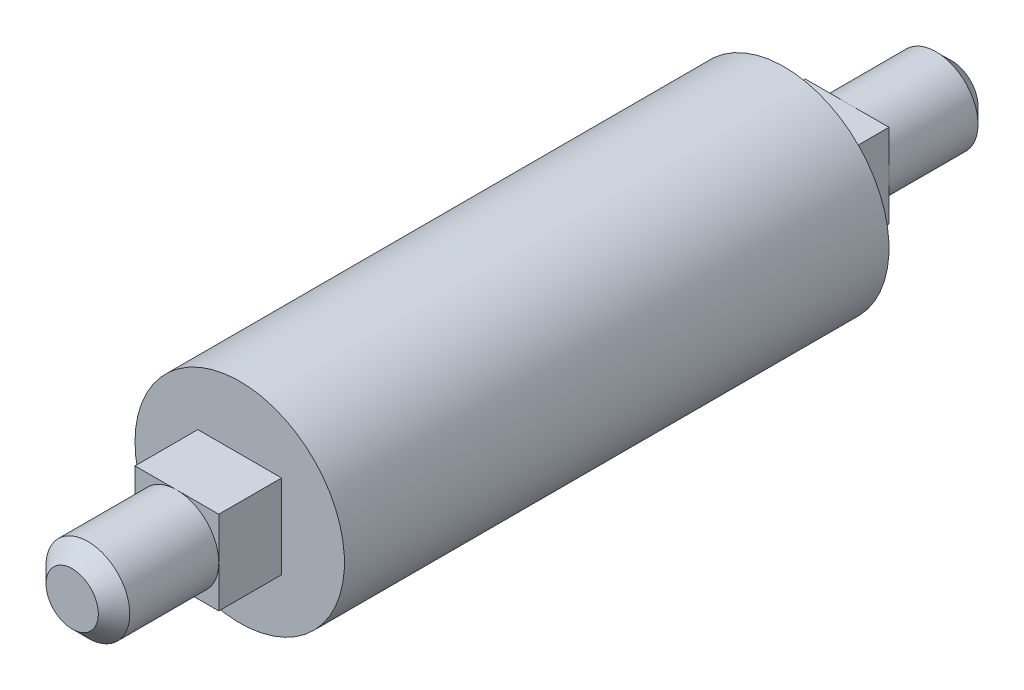
ISO-10303-21;
HEADER;
FILE_DESCRIPTION(('STEP AP214'),'2;1');
FILE_NAME('part.step','',(''),(''),'','','');
FILE_SCHEMA(('AUTOMOTIVE_DESIGN { 1 0 10303 214 1 1 1 1 }'));
ENDSEC;
DATA;
#1=APPLICATION_CONTEXT('core data for automotive mechanical design processes');
#2=APPLICATION_PROTOCOL_DEFINITION('international standard','automotive_design',2000,#1);
#3=PRODUCT_CONTEXT('',#1,'mechanical');
#4=PRODUCT('Part','Part','',(#3));
#5=PRODUCT_RELATED_PRODUCT_CATEGORY('part','',(#4));
#6=PRODUCT_DEFINITION_FORMATION('','',#4);
#7=PRODUCT_DEFINITION_CONTEXT('part definition',#1,'design');
#8=PRODUCT_DEFINITION('design','',#6,#7);
#9=PRODUCT_DEFINITION_SHAPE('','',#8);
#10=(LENGTH_UNIT() NAMED_UNIT(*) SI_UNIT(.MILLI.,.METRE.));
#11=(NAMED_UNIT(*) PLANE_ANGLE_UNIT() SI_UNIT($,.RADIAN.));
#12=(NAMED_UNIT(*) SI_UNIT($,.STERADIAN.) SOLID_ANGLE_UNIT());
#13=UNCERTAINTY_MEASURE_WITH_UNIT(LENGTH_MEASURE(1.E-05),#10,'distance_accuracy_value','');
#14=(GEOMETRIC_REPRESENTATION_CONTEXT(3) GLOBAL_UNCERTAINTY_ASSIGNED_CONTEXT((#13)) GLOBAL_UNIT_ASSIGNED_CONTEXT((#10,
#11,#12)) REPRESENTATION_CONTEXT('',''));
#15=CARTESIAN_POINT('',(0.,0.,0.));
#16=DIRECTION('',(0.,0.,1.));
#17=DIRECTION('',(1.,0.,0.));
#18=AXIS2_PLACEMENT_3D('',#15,#16,#17);
#19=CARTESIAN_POINT('',(0.,0.,32.));
#20=DIRECTION('',(0.,0.,1.));
#21=DIRECTION('',(1.,0.,0.));
#22=AXIS2_PLACEMENT_3D('',#19,#20,#21);
#23=PLANE('',#22);
#24=CARTESIAN_POINT('',(0.,0.,32.));
#25=DIRECTION('',(0.,0.,1.));
#26=DIRECTION('',(1.,0.,0.));
#27=AXIS2_PLACEMENT_3D('',#24,#25,#26);
#28=CIRCLE('',#27,4.);
#29=CARTESIAN_POINT('',(4.,0.,32.));
#30=VERTEX_POINT('',#29);
#31=CARTESIAN_POINT('',(0.,4.,32.));
#32=VERTEX_POINT('',#31);
#33=EDGE_CURVE('E206',#30,#32,#28,.T.);
#34=ORIENTED_EDGE('',*,*,#33,.F.);
#35=DIRECTION('',(0.,1.,0.));
#36=VECTOR('',#35,1.);
#37=CARTESIAN_POINT('',(4.,-4.,32.));
#38=LINE('',#37,#36);
#39=CARTESIAN_POINT('',(4.,4.,32.));
#40=VERTEX_POINT('',#39);
#41=EDGE_CURVE('E217',#30,#40,#38,.T.);
#42=ORIENTED_EDGE('',*,*,#41,.T.);
#43=DIRECTION('',(-1.,0.,0.));
#44=VECTOR('',#43,1.);
#45=CARTESIAN_POINT('',(4.,4.,32.));
#46=LINE('',#45,#44);
#47=EDGE_CURVE('E221',#40,#32,#46,.T.);
#48=ORIENTED_EDGE('',*,*,#47,.T.);
#49=EDGE_LOOP('',(#34,#42,#48));
#50=FACE_BOUND('',#49,.T.);
#51=ADVANCED_FACE('F37',(#50),#23,.T.);
#52=CARTESIAN_POINT('',(-4.,0.,32.));
#53=VERTEX_POINT('',#52);
#54=EDGE_CURVE('E52',#32,#53,#28,.T.);
#55=ORIENTED_EDGE('',*,*,#54,.F.);
#56=CARTESIAN_POINT('',(-4.,4.,32.));
#57=VERTEX_POINT('',#56);
#58=EDGE_CURVE('E220',#32,#57,#46,.T.);
#59=ORIENTED_EDGE('',*,*,#58,.T.);
#60=DIRECTION('',(0.,-1.,0.));
#61=VECTOR('',#60,1.);
#62=CARTESIAN_POINT('',(-4.,-4.,32.));
#63=LINE('',#62,#61);
#64=EDGE_CURVE('E210',#57,#53,#63,.T.);
#65=ORIENTED_EDGE('',*,*,#64,.T.);
#66=EDGE_LOOP('',(#55,#59,#65));
#67=FACE_BOUND('',#66,.T.);
#68=ADVANCED_FACE('F265',(#67),#23,.T.);
#69=CARTESIAN_POINT('',(0.,-4.,32.));
#70=VERTEX_POINT('',#69);
#71=EDGE_CURVE('E252',#53,#70,#28,.T.);
#72=ORIENTED_EDGE('',*,*,#71,.F.);
#73=CARTESIAN_POINT('',(-4.,-4.,32.));
#74=VERTEX_POINT('',#73);
#75=EDGE_CURVE('E213',#53,#74,#63,.T.);
#76=ORIENTED_EDGE('',*,*,#75,.T.);
#77=DIRECTION('',(1.,0.,0.));
#78=VECTOR('',#77,1.);
#79=CARTESIAN_POINT('',(4.,-4.,32.));
#80=LINE('',#79,#78);
#81=EDGE_CURVE('E214',#74,#70,#80,.T.);
#82=ORIENTED_EDGE('',*,*,#81,.T.);
#83=EDGE_LOOP('',(#72,#76,#82));
#84=FACE_BOUND('',#83,.T.);
#85=ADVANCED_FACE('F272',(#84),#23,.T.);
#86=CARTESIAN_POINT('',(0.,0.,26.));
#87=DIRECTION('',(0.,0.,-1.));
#88=DIRECTION('',(-1.,0.,0.));
#89=AXIS2_PLACEMENT_3D('',#86,#87,#88);
#90=CYLINDRICAL_SURFACE('',#89,10.);
#91=CARTESIAN_POINT('',(0.,0.,26.));
#92=DIRECTION('',(0.,0.,1.));
#93=DIRECTION('',(1.,0.,0.));
#94=AXIS2_PLACEMENT_3D('',#91,#92,#93);
#95=CIRCLE('',#94,10.);
#96=CARTESIAN_POINT('',(-10.,0.,26.));
#97=VERTEX_POINT('',#96);
#98=EDGE_CURVE('E247',#97,#97,#95,.T.);
#99=CARTESIAN_POINT('',(0.,0.,-26.));
#100=DIRECTION('',(0.,0.,1.));
#101=DIRECTION('',(1.,0.,0.));
#102=AXIS2_PLACEMENT_3D('',#99,#100,#101);
#103=CIRCLE('',#102,10.);
#104=CARTESIAN_POINT('',(-10.,0.,-26.));
#105=VERTEX_POINT('',#104);
#106=EDGE_CURVE('E138',#105,#105,#103,.T.);
#107=CARTESIAN_POINT('',(-10.,0.,26.));
#108=CARTESIAN_POINT('',(-10.,0.,25.4583333333333));
#109=CARTESIAN_POINT('',(-10.,0.,24.9166666666667));
#110=CARTESIAN_POINT('',(-10.,0.,23.8333333333333));
#111=CARTESIAN_POINT('',(-10.,0.,23.2916666666667));
#112=CARTESIAN_POINT('',(-10.,0.,22.2083333333333));
#113=CARTESIAN_POINT('',(-10.,0.,21.6666666666667));
#114=CARTESIAN_POINT('',(-10.,0.,20.5833333333333));
#115=CARTESIAN_POINT('',(-10.,0.,20.0416666666667));
#116=CARTESIAN_POINT('',(-10.,0.,18.9583333333333));
#117=CARTESIAN_POINT('',(-10.,0.,18.4166666666667));
#118=CARTESIAN_POINT('',(-10.,0.,17.3333333333333));
#119=CARTESIAN_POINT('',(-10.,0.,16.7916666666667));
#120=CARTESIAN_POINT('',(-10.,0.,15.7083333333333));
#121=CARTESIAN_POINT('',(-10.,0.,15.1666666666667));
#122=CARTESIAN_POINT('',(-10.,0.,14.0833333333333));
#123=CARTESIAN_POINT('',(-10.,0.,13.5416666666667));
#124=CARTESIAN_POINT('',(-10.,0.,12.4583333333333));
#125=CARTESIAN_POINT('',(-10.,0.,11.9166666666667));
#126=CARTESIAN_POINT('',(-10.,0.,10.8333333333333));
#127=CARTESIAN_POINT('',(-10.,0.,10.2916666666667));
#128=CARTESIAN_POINT('',(-10.,0.,9.20833333333333));
#129=CARTESIAN_POINT('',(-10.,0.,8.66666666666666));
#130=CARTESIAN_POINT('',(-10.,0.,7.58333333333333));
#131=CARTESIAN_POINT('',(-10.,0.,7.04166666666666));
#132=CARTESIAN_POINT('',(-10.,0.,5.95833333333333));
#133=CARTESIAN_POINT('',(-10.,0.,5.41666666666666));
#134=CARTESIAN_POINT('',(-10.,0.,4.33333333333333));
#135=CARTESIAN_POINT('',(-10.,0.,3.79166666666666));
#136=CARTESIAN_POINT('',(-10.,0.,2.70833333333333));
#137=CARTESIAN_POINT('',(-10.,0.,2.16666666666666));
#138=CARTESIAN_POINT('',(-10.,0.,1.08333333333333));
#139=CARTESIAN_POINT('',(-10.,0.,0.541666666666664));
#140=CARTESIAN_POINT('',(-10.,0.,-0.54166666666667));
#141=CARTESIAN_POINT('',(-10.,0.,-1.08333333333334));
#142=CARTESIAN_POINT('',(-10.,0.,-2.16666666666667));
#143=CARTESIAN_POINT('',(-10.,0.,-2.70833333333334));
#144=CARTESIAN_POINT('',(-10.,0.,-3.79166666666667));
#145=CARTESIAN_POINT('',(-10.,0.,-4.33333333333334));
#146=CARTESIAN_POINT('',(-10.,0.,-5.41666666666667));
#147=CARTESIAN_POINT('',(-10.,0.,-5.95833333333333));
#148=CARTESIAN_POINT('',(-10.,0.,-7.04166666666666));
#149=CARTESIAN_POINT('',(-10.,0.,-7.58333333333333));
#150=CARTESIAN_POINT('',(-10.,0.,-8.66666666666666));
#151=CARTESIAN_POINT('',(-10.,0.,-9.20833333333333));
#152=CARTESIAN_POINT('',(-10.,0.,-10.2916666666667));
#153=CARTESIAN_POINT('',(-10.,0.,-10.8333333333333));
#154=CARTESIAN_POINT('',(-10.,0.,-11.9166666666667));
#155=CARTESIAN_POINT('',(-10.,0.,-12.4583333333333));
#156=CARTESIAN_POINT('',(-10.,0.,-13.5416666666667));
#157=CARTESIAN_POINT('',(-10.,0.,-14.0833333333333));
#158=CARTESIAN_POINT('',(-10.,0.,-15.1666666666667));
#159=CARTESIAN_POINT('',(-10.,0.,-15.7083333333333));
#160=CARTESIAN_POINT('',(-10.,0.,-16.7916666666667));
#161=CARTESIAN_POINT('',(-10.,0.,-17.3333333333333));
#162=CARTESIAN_POINT('',(-10.,0.,-18.4166666666667));
#163=CARTESIAN_POINT('',(-10.,0.,-18.9583333333333));
#164=CARTESIAN_POINT('',(-10.,0.,-20.0416666666667));
#165=CARTESIAN_POINT('',(-10.,0.,-20.5833333333333));
#166=CARTESIAN_POINT('',(-10.,0.,-21.6666666666667));
#167=CARTESIAN_POINT('',(-10.,0.,-22.2083333333333));
#168=CARTESIAN_POINT('',(-10.,0.,-23.2916666666667));
#169=CARTESIAN_POINT('',(-10.,0.,-23.8333333333333));
#170=CARTESIAN_POINT('',(-10.,0.,-24.9166666666667));
#171=CARTESIAN_POINT('',(-10.,0.,-25.4583333333333));
#172=CARTESIAN_POINT('',(-10.,0.,-26.));
#173=B_SPLINE_CURVE_WITH_KNOTS('',3,(#107,#108,#109,#110,#111,#112,#113,#114,#115,#116,#117,
#118,#119,#120,#121,#122,#123,#124,#125,#126,#127,#128,#129,#130,#131,#132,#133,#134,#135,#136,
#137,#138,#139,#140,#141,#142,#143,#144,#145,#146,#147,#148,#149,#150,#151,#152,#153,#154,#155,
#156,#157,#158,#159,#160,#161,#162,#163,#164,#165,#166,#167,#168,#169,#170,#171,#172),
.UNSPECIFIED.,.F.,.F.,(4,2,2,2,2,2,2,2,2,2,2,2,2,2,2,2,2,2,2,2,2,2,2,2,2,2,2,2,2,2,2,2,4),(0.,
1.625,3.25,4.875,6.5,8.125,9.75,11.375,13.,14.625,16.25,17.875,19.5,21.125,22.75,24.375,26.,
27.625,29.25,30.875,32.5,34.125,35.75,37.375,39.,40.625,42.25,43.875,45.5,47.125,48.75,50.375,
52.),.UNSPECIFIED.);
#174=EDGE_CURVE('BSEAM284',#97,#105,#173,.T.);
#175=ORIENTED_EDGE('',*,*,#98,.F.);
#176=ORIENTED_EDGE('',*,*,#106,.T.);
#177=ORIENTED_EDGE('',*,*,#174,.T.);
#178=ORIENTED_EDGE('',*,*,#174,.F.);
#179=EDGE_LOOP('',(#175,#177,#176,#178));
#180=FACE_BOUND('',#179,.T.);
#181=ADVANCED_FACE('F284',(#180),#90,.T.);
#182=CARTESIAN_POINT('',(0.,0.,26.));
#183=DIRECTION('',(0.,0.,1.));
#184=DIRECTION('',(1.,0.,0.));
#185=AXIS2_PLACEMENT_3D('',#182,#183,#184);
#186=PLANE('',#185);
#187=DIRECTION('',(0.,-1.,0.));
#188=VECTOR('',#187,1.);
#189=CARTESIAN_POINT('',(-4.,-4.,26.));
#190=LINE('',#189,#188);
#191=CARTESIAN_POINT('',(-4.,4.,26.));
#192=VERTEX_POINT('',#191);
#193=CARTESIAN_POINT('',(-4.,-4.,26.));
#194=VERTEX_POINT('',#193);
#195=EDGE_CURVE('E209',#192,#194,#190,.T.);
#196=ORIENTED_EDGE('',*,*,#195,.F.);
#197=DIRECTION('',(-1.,0.,0.));
#198=VECTOR('',#197,1.);
#199=CARTESIAN_POINT('',(4.,4.,26.));
#200=LINE('',#199,#198);
#201=CARTESIAN_POINT('',(4.,4.,26.));
#202=VERTEX_POINT('',#201);
#203=EDGE_CURVE('E233',#202,#192,#200,.T.);
#204=ORIENTED_EDGE('',*,*,#203,.F.);
#205=DIRECTION('',(0.,1.,0.));
#206=VECTOR('',#205,1.);
#207=CARTESIAN_POINT('',(4.,-4.,26.));
#208=LINE('',#207,#206);
#209=CARTESIAN_POINT('',(4.,-4.,26.));
#210=VERTEX_POINT('',#209);
#211=EDGE_CURVE('E230',#210,#202,#208,.T.);
#212=ORIENTED_EDGE('',*,*,#211,.F.);
#213=DIRECTION('',(1.,0.,0.));
#214=VECTOR('',#213,1.);
#215=CARTESIAN_POINT('',(4.,-4.,26.));
#216=LINE('',#215,#214);
#217=EDGE_CURVE('E227',#194,#210,#216,.T.);
#218=ORIENTED_EDGE('',*,*,#217,.F.);
#219=EDGE_LOOP('',(#196,#204,#212,#218));
#220=FACE_BOUND('',#219,.T.);
#221=ORIENTED_EDGE('',*,*,#98,.T.);
#222=EDGE_LOOP('',(#221));
#223=FACE_BOUND('',#222,.T.);
#224=ADVANCED_FACE('F281',(#220,#223),#186,.T.);
#225=CARTESIAN_POINT('',(-4.,-4.,32.));
#226=DIRECTION('',(1.,0.,0.));
#227=DIRECTION('',(0.,0.,-1.));
#228=AXIS2_PLACEMENT_3D('',#225,#226,#227);
#229=PLANE('',#228);
#230=ORIENTED_EDGE('',*,*,#195,.T.);
#231=DIRECTION('',(0.,0.,-1.));
#232=VECTOR('',#231,1.);
#233=CARTESIAN_POINT('',(-4.,-4.,32.));
#234=LINE('',#233,#232);
#235=EDGE_CURVE('E244',#74,#194,#234,.T.);
#236=ORIENTED_EDGE('',*,*,#235,.F.);
#237=ORIENTED_EDGE('',*,*,#75,.F.);
#238=ORIENTED_EDGE('',*,*,#64,.F.);
#239=DIRECTION('',(0.,0.,-1.));
#240=VECTOR('',#239,1.);
#241=CARTESIAN_POINT('',(-4.,4.,32.));
#242=LINE('',#241,#240);
#243=EDGE_CURVE('E224',#57,#192,#242,.T.);
#244=ORIENTED_EDGE('',*,*,#243,.T.);
#245=EDGE_LOOP('',(#230,#236,#237,#238,#244));
#246=FACE_BOUND('',#245,.T.);
#247=ADVANCED_FACE('F268',(#246),#229,.F.);
#248=CARTESIAN_POINT('',(4.,-4.,32.));
#249=DIRECTION('',(0.,1.,0.));
#250=DIRECTION('',(-1.,0.,0.));
#251=AXIS2_PLACEMENT_3D('',#248,#249,#250);
#252=PLANE('',#251);
#253=ORIENTED_EDGE('',*,*,#217,.T.);
#254=DIRECTION('',(0.,0.,-1.));
#255=VECTOR('',#254,1.);
#256=CARTESIAN_POINT('',(4.,-4.,32.));
#257=LINE('',#256,#255);
#258=CARTESIAN_POINT('',(4.,-4.,32.));
#259=VERTEX_POINT('',#258);
#260=EDGE_CURVE('E241',#259,#210,#257,.T.);
#261=ORIENTED_EDGE('',*,*,#260,.F.);
#262=EDGE_CURVE('E212',#70,#259,#80,.T.);
#263=ORIENTED_EDGE('',*,*,#262,.F.);
#264=ORIENTED_EDGE('',*,*,#81,.F.);
#265=ORIENTED_EDGE('',*,*,#235,.T.);
#266=EDGE_LOOP('',(#253,#261,#263,#264,#265));
#267=FACE_BOUND('',#266,.T.);
#268=ADVANCED_FACE('F274',(#267),#252,.F.);
#269=CARTESIAN_POINT('',(4.,-4.,32.));
#270=DIRECTION('',(-1.,0.,0.));
#271=DIRECTION('',(0.,0.,1.));
#272=AXIS2_PLACEMENT_3D('',#269,#270,#271);
#273=PLANE('',#272);
#274=ORIENTED_EDGE('',*,*,#211,.T.);
#275=DIRECTION('',(0.,0.,-1.));
#276=VECTOR('',#275,1.);
#277=CARTESIAN_POINT('',(4.,4.,32.));
#278=LINE('',#277,#276);
#279=EDGE_CURVE('E238',#40,#202,#278,.T.);
#280=ORIENTED_EDGE('',*,*,#279,.F.);
#281=ORIENTED_EDGE('',*,*,#41,.F.);
#282=EDGE_CURVE('E218',#259,#30,#38,.T.);
#283=ORIENTED_EDGE('',*,*,#282,.F.);
#284=ORIENTED_EDGE('',*,*,#260,.T.);
#285=EDGE_LOOP('',(#274,#280,#281,#283,#284));
#286=FACE_BOUND('',#285,.T.);
#287=ADVANCED_FACE('F279',(#286),#273,.F.);
#288=CARTESIAN_POINT('',(4.,4.,32.));
#289=DIRECTION('',(0.,-1.,0.));
#290=DIRECTION('',(1.,0.,0.));
#291=AXIS2_PLACEMENT_3D('',#288,#289,#290);
#292=PLANE('',#291);
#293=ORIENTED_EDGE('',*,*,#203,.T.);
#294=ORIENTED_EDGE('',*,*,#243,.F.);
#295=ORIENTED_EDGE('',*,*,#58,.F.);
#296=ORIENTED_EDGE('',*,*,#47,.F.);
#297=ORIENTED_EDGE('',*,*,#279,.T.);
#298=EDGE_LOOP('',(#293,#294,#295,#296,#297));
#299=FACE_BOUND('',#298,.T.);
#300=ADVANCED_FACE('F262',(#299),#292,.F.);
#301=EDGE_CURVE('E60',#70,#30,#28,.T.);
#302=ORIENTED_EDGE('',*,*,#301,.F.);
#303=ORIENTED_EDGE('',*,*,#262,.T.);
#304=ORIENTED_EDGE('',*,*,#282,.T.);
#305=EDGE_LOOP('',(#302,#303,#304));
#306=FACE_BOUND('',#305,.T.);
#307=ADVANCED_FACE('F277',(#306),#23,.T.);
#308=CARTESIAN_POINT('',(0.,0.,42.));
#309=DIRECTION('',(0.,0.,-1.));
#310=DIRECTION('',(-1.,0.,0.));
#311=AXIS2_PLACEMENT_3D('',#308,#309,#310);
#312=CYLINDRICAL_SURFACE('',#311,4.);
#313=CARTESIAN_POINT('',(0.,0.,40.5));
#314=DIRECTION('',(0.,0.,1.));
#315=DIRECTION('',(1.,0.,0.));
#316=AXIS2_PLACEMENT_3D('',#313,#314,#315);
#317=CIRCLE('',#316,4.);
#318=CARTESIAN_POINT('',(4.,0.,40.5));
#319=VERTEX_POINT('',#318);
#320=EDGE_CURVE('E11',#319,#319,#317,.F.);
#321=ORIENTED_EDGE('',*,*,#320,.T.);
#322=EDGE_LOOP('',(#321));
#323=FACE_BOUND('',#322,.T.);
#324=ORIENTED_EDGE('',*,*,#33,.T.);
#325=ORIENTED_EDGE('',*,*,#54,.T.);
#326=ORIENTED_EDGE('',*,*,#71,.T.);
#327=ORIENTED_EDGE('',*,*,#301,.T.);
#328=EDGE_LOOP('',(#324,#325,#326,#327));
#329=FACE_BOUND('',#328,.T.);
#330=ADVANCED_FACE('F255',(#323,#329),#312,.T.);
#331=CARTESIAN_POINT('',(0.,0.,42.));
#332=DIRECTION('',(0.,0.,1.));
#333=DIRECTION('',(1.,0.,0.));
#334=AXIS2_PLACEMENT_3D('',#331,#332,#333);
#335=PLANE('',#334);
#336=CARTESIAN_POINT('',(0.,0.,42.));
#337=DIRECTION('',(0.,0.,1.));
#338=DIRECTION('',(1.,0.,0.));
#339=AXIS2_PLACEMENT_3D('',#336,#337,#338);
#340=CIRCLE('',#339,2.5);
#341=CARTESIAN_POINT('',(2.5,0.,42.));
#342=VERTEX_POINT('',#341);
#343=EDGE_CURVE('E45',#342,#342,#340,.T.);
#344=ORIENTED_EDGE('',*,*,#343,.T.);
#345=EDGE_LOOP('',(#344));
#346=FACE_BOUND('',#345,.T.);
#347=ADVANCED_FACE('F317',(#346),#335,.T.);
#348=CARTESIAN_POINT('',(0.,0.,42.));
#349=DIRECTION('',(0.,0.,-1.));
#350=DIRECTION('',(-1.,0.,0.));
#351=AXIS2_PLACEMENT_3D('',#348,#349,#350);
#352=CONICAL_SURFACE('',#351,2.5,0.785398163397447);
#353=ORIENTED_EDGE('',*,*,#320,.F.);
#354=EDGE_LOOP('',(#353));
#355=FACE_BOUND('',#354,.T.);
#356=ORIENTED_EDGE('',*,*,#343,.F.);
#357=EDGE_LOOP('',(#356));
#358=FACE_BOUND('',#357,.T.);
#359=ADVANCED_FACE('F39',(#355,#358),#352,.T.);
#360=CARTESIAN_POINT('',(0.,0.,-32.));
#361=DIRECTION('',(0.,0.,-1.));
#362=DIRECTION('',(1.,0.,0.));
#363=AXIS2_PLACEMENT_3D('',#360,#361,#362);
#364=PLANE('',#363);
#365=CARTESIAN_POINT('',(0.,0.,-32.));
#366=DIRECTION('',(0.,0.,1.));
#367=DIRECTION('',(1.,0.,0.));
#368=AXIS2_PLACEMENT_3D('',#365,#366,#367);
#369=CIRCLE('',#368,4.);
#370=CARTESIAN_POINT('',(4.,0.,-32.));
#371=VERTEX_POINT('',#370);
#372=CARTESIAN_POINT('',(0.,4.,-32.));
#373=VERTEX_POINT('',#372);
#374=EDGE_CURVE('E140',#371,#373,#369,.T.);
#375=ORIENTED_EDGE('',*,*,#374,.T.);
#376=DIRECTION('',(-1.,0.,0.));
#377=VECTOR('',#376,1.);
#378=CARTESIAN_POINT('',(4.,4.,-32.));
#379=LINE('',#378,#377);
#380=CARTESIAN_POINT('',(4.,4.,-32.));
#381=VERTEX_POINT('',#380);
#382=EDGE_CURVE('E155',#381,#373,#379,.T.);
#383=ORIENTED_EDGE('',*,*,#382,.F.);
#384=DIRECTION('',(0.,1.,0.));
#385=VECTOR('',#384,1.);
#386=CARTESIAN_POINT('',(4.,-4.,-32.));
#387=LINE('',#386,#385);
#388=EDGE_CURVE('E146',#371,#381,#387,.T.);
#389=ORIENTED_EDGE('',*,*,#388,.F.);
#390=EDGE_LOOP('',(#375,#383,#389));
#391=FACE_BOUND('',#390,.T.);
#392=ADVANCED_FACE('F153',(#391),#364,.T.);
#393=CARTESIAN_POINT('',(-4.,0.,-32.));
#394=VERTEX_POINT('',#393);
#395=EDGE_CURVE('E160',#373,#394,#369,.T.);
#396=ORIENTED_EDGE('',*,*,#395,.T.);
#397=DIRECTION('',(0.,-1.,0.));
#398=VECTOR('',#397,1.);
#399=CARTESIAN_POINT('',(-4.,-4.,-32.));
#400=LINE('',#399,#398);
#401=CARTESIAN_POINT('',(-4.,4.,-32.));
#402=VERTEX_POINT('',#401);
#403=EDGE_CURVE('E180',#402,#394,#400,.T.);
#404=ORIENTED_EDGE('',*,*,#403,.F.);
#405=EDGE_CURVE('E149',#373,#402,#379,.T.);
#406=ORIENTED_EDGE('',*,*,#405,.F.);
#407=EDGE_LOOP('',(#396,#404,#406));
#408=FACE_BOUND('',#407,.T.);
#409=ADVANCED_FACE('F302',(#408),#364,.T.);
#410=CARTESIAN_POINT('',(0.,-4.,-32.));
#411=VERTEX_POINT('',#410);
#412=EDGE_CURVE('E137',#394,#411,#369,.T.);
#413=ORIENTED_EDGE('',*,*,#412,.T.);
#414=DIRECTION('',(1.,0.,0.));
#415=VECTOR('',#414,1.);
#416=CARTESIAN_POINT('',(4.,-4.,-32.));
#417=LINE('',#416,#415);
#418=CARTESIAN_POINT('',(-4.,-4.,-32.));
#419=VERTEX_POINT('',#418);
#420=EDGE_CURVE('E156',#419,#411,#417,.T.);
#421=ORIENTED_EDGE('',*,*,#420,.F.);
#422=EDGE_CURVE('E177',#394,#419,#400,.T.);
#423=ORIENTED_EDGE('',*,*,#422,.F.);
#424=EDGE_LOOP('',(#413,#421,#423));
#425=FACE_BOUND('',#424,.T.);
#426=ADVANCED_FACE('F175',(#425),#364,.T.);
#427=CARTESIAN_POINT('',(0.,0.,-26.));
#428=DIRECTION('',(0.,0.,-1.));
#429=DIRECTION('',(1.,0.,0.));
#430=AXIS2_PLACEMENT_3D('',#427,#428,#429);
#431=PLANE('',#430);
#432=DIRECTION('',(0.,-1.,0.));
#433=VECTOR('',#432,1.);
#434=CARTESIAN_POINT('',(-4.,-4.,-26.));
#435=LINE('',#434,#433);
#436=CARTESIAN_POINT('',(-4.,4.,-26.));
#437=VERTEX_POINT('',#436);
#438=CARTESIAN_POINT('',(-4.,-4.,-26.));
#439=VERTEX_POINT('',#438);
#440=EDGE_CURVE('E161',#437,#439,#435,.T.);
#441=ORIENTED_EDGE('',*,*,#440,.T.);
#442=DIRECTION('',(1.,0.,0.));
#443=VECTOR('',#442,1.);
#444=CARTESIAN_POINT('',(4.,-4.,-26.));
#445=LINE('',#444,#443);
#446=CARTESIAN_POINT('',(4.,-4.,-26.));
#447=VERTEX_POINT('',#446);
#448=EDGE_CURVE('E163',#439,#447,#445,.T.);
#449=ORIENTED_EDGE('',*,*,#448,.T.);
#450=DIRECTION('',(0.,1.,0.));
#451=VECTOR('',#450,1.);
#452=CARTESIAN_POINT('',(4.,-4.,-26.));
#453=LINE('',#452,#451);
#454=CARTESIAN_POINT('',(4.,4.,-26.));
#455=VERTEX_POINT('',#454);
#456=EDGE_CURVE('E191',#447,#455,#453,.T.);
#457=ORIENTED_EDGE('',*,*,#456,.T.);
#458=DIRECTION('',(-1.,0.,0.));
#459=VECTOR('',#458,1.);
#460=CARTESIAN_POINT('',(4.,4.,-26.));
#461=LINE('',#460,#459);
#462=EDGE_CURVE('E186',#455,#437,#461,.T.);
#463=ORIENTED_EDGE('',*,*,#462,.T.);
#464=EDGE_LOOP('',(#441,#449,#457,#463));
#465=FACE_BOUND('',#464,.T.);
#466=ORIENTED_EDGE('',*,*,#106,.F.);
#467=EDGE_LOOP('',(#466));
#468=FACE_BOUND('',#467,.T.);
#469=ADVANCED_FACE('F292',(#465,#468),#431,.T.);
#470=CARTESIAN_POINT('',(-4.,-4.,-32.));
#471=DIRECTION('',(1.,0.,0.));
#472=DIRECTION('',(0.,0.,1.));
#473=AXIS2_PLACEMENT_3D('',#470,#471,#472);
#474=PLANE('',#473);
#475=ORIENTED_EDGE('',*,*,#440,.F.);
#476=DIRECTION('',(0.,0.,1.));
#477=VECTOR('',#476,1.);
#478=CARTESIAN_POINT('',(-4.,4.,-32.));
#479=LINE('',#478,#477);
#480=EDGE_CURVE('E183',#402,#437,#479,.T.);
#481=ORIENTED_EDGE('',*,*,#480,.F.);
#482=ORIENTED_EDGE('',*,*,#403,.T.);
#483=ORIENTED_EDGE('',*,*,#422,.T.);
#484=DIRECTION('',(0.,0.,1.));
#485=VECTOR('',#484,1.);
#486=CARTESIAN_POINT('',(-4.,-4.,-32.));
#487=LINE('',#486,#485);
#488=EDGE_CURVE('E200',#419,#439,#487,.T.);
#489=ORIENTED_EDGE('',*,*,#488,.T.);
#490=EDGE_LOOP('',(#475,#481,#482,#483,#489));
#491=FACE_BOUND('',#490,.T.);
#492=ADVANCED_FACE('F182',(#491),#474,.F.);
#493=CARTESIAN_POINT('',(4.,-4.,-32.));
#494=DIRECTION('',(0.,1.,0.));
#495=DIRECTION('',(-1.,0.,0.));
#496=AXIS2_PLACEMENT_3D('',#493,#494,#495);
#497=PLANE('',#496);
#498=ORIENTED_EDGE('',*,*,#448,.F.);
#499=ORIENTED_EDGE('',*,*,#488,.F.);
#500=ORIENTED_EDGE('',*,*,#420,.T.);
#501=CARTESIAN_POINT('',(4.,-4.,-32.));
#502=VERTEX_POINT('',#501);
#503=EDGE_CURVE('E132',#411,#502,#417,.T.);
#504=ORIENTED_EDGE('',*,*,#503,.T.);
#505=DIRECTION('',(0.,0.,1.));
#506=VECTOR('',#505,1.);
#507=CARTESIAN_POINT('',(4.,-4.,-32.));
#508=LINE('',#507,#506);
#509=EDGE_CURVE('E148',#502,#447,#508,.T.);
#510=ORIENTED_EDGE('',*,*,#509,.T.);
#511=EDGE_LOOP('',(#498,#499,#500,#504,#510));
#512=FACE_BOUND('',#511,.T.);
#513=ADVANCED_FACE('F300',(#512),#497,.F.);
#514=CARTESIAN_POINT('',(4.,-4.,-32.));
#515=DIRECTION('',(-1.,0.,0.));
#516=DIRECTION('',(0.,0.,-1.));
#517=AXIS2_PLACEMENT_3D('',#514,#515,#516);
#518=PLANE('',#517);
#519=ORIENTED_EDGE('',*,*,#456,.F.);
#520=ORIENTED_EDGE('',*,*,#509,.F.);
#521=EDGE_CURVE('E129',#502,#371,#387,.T.);
#522=ORIENTED_EDGE('',*,*,#521,.T.);
#523=ORIENTED_EDGE('',*,*,#388,.T.);
#524=DIRECTION('',(0.,0.,1.));
#525=VECTOR('',#524,1.);
#526=CARTESIAN_POINT('',(4.,4.,-32.));
#527=LINE('',#526,#525);
#528=EDGE_CURVE('E197',#381,#455,#527,.T.);
#529=ORIENTED_EDGE('',*,*,#528,.T.);
#530=EDGE_LOOP('',(#519,#520,#522,#523,#529));
#531=FACE_BOUND('',#530,.T.);
#532=ADVANCED_FACE('F145',(#531),#518,.F.);
#533=CARTESIAN_POINT('',(4.,4.,-32.));
#534=DIRECTION('',(0.,-1.,0.));
#535=DIRECTION('',(1.,0.,0.));
#536=AXIS2_PLACEMENT_3D('',#533,#534,#535);
#537=PLANE('',#536);
#538=ORIENTED_EDGE('',*,*,#462,.F.);
#539=ORIENTED_EDGE('',*,*,#528,.F.);
#540=ORIENTED_EDGE('',*,*,#382,.T.);
#541=ORIENTED_EDGE('',*,*,#405,.T.);
#542=ORIENTED_EDGE('',*,*,#480,.T.);
#543=EDGE_LOOP('',(#538,#539,#540,#541,#542));
#544=FACE_BOUND('',#543,.T.);
#545=ADVANCED_FACE('F440',(#544),#537,.F.);
#546=EDGE_CURVE('E126',#411,#371,#369,.T.);
#547=ORIENTED_EDGE('',*,*,#546,.T.);
#548=ORIENTED_EDGE('',*,*,#521,.F.);
#549=ORIENTED_EDGE('',*,*,#503,.F.);
#550=EDGE_LOOP('',(#547,#548,#549));
#551=FACE_BOUND('',#550,.T.);
#552=ADVANCED_FACE('F128',(#551),#364,.T.);
#553=CARTESIAN_POINT('',(0.,0.,-42.));
#554=DIRECTION('',(0.,0.,1.));
#555=DIRECTION('',(-1.,0.,0.));
#556=AXIS2_PLACEMENT_3D('',#553,#554,#555);
#557=CYLINDRICAL_SURFACE('',#556,4.);
#558=CARTESIAN_POINT('',(0.,0.,-40.5));
#559=DIRECTION('',(0.,0.,1.));
#560=DIRECTION('',(1.,0.,0.));
#561=AXIS2_PLACEMENT_3D('',#558,#559,#560);
#562=CIRCLE('',#561,4.);
#563=CARTESIAN_POINT('',(4.,0.,-40.5));
#564=VERTEX_POINT('',#563);
#565=EDGE_CURVE('E170',#564,#564,#562,.F.);
#566=ORIENTED_EDGE('',*,*,#565,.F.);
#567=EDGE_LOOP('',(#566));
#568=FACE_BOUND('',#567,.T.);
#569=ORIENTED_EDGE('',*,*,#374,.F.);
#570=ORIENTED_EDGE('',*,*,#546,.F.);
#571=ORIENTED_EDGE('',*,*,#412,.F.);
#572=ORIENTED_EDGE('',*,*,#395,.F.);
#573=EDGE_LOOP('',(#569,#570,#571,#572));
#574=FACE_BOUND('',#573,.T.);
#575=ADVANCED_FACE('F158',(#568,#574),#557,.T.);
#576=CARTESIAN_POINT('',(0.,0.,-42.));
#577=DIRECTION('',(0.,0.,-1.));
#578=DIRECTION('',(1.,0.,0.));
#579=AXIS2_PLACEMENT_3D('',#576,#577,#578);
#580=PLANE('',#579);
#581=CARTESIAN_POINT('',(0.,0.,-42.));
#582=DIRECTION('',(0.,0.,1.));
#583=DIRECTION('',(1.,0.,0.));
#584=AXIS2_PLACEMENT_3D('',#581,#582,#583);
#585=CIRCLE('',#584,2.5);
#586=CARTESIAN_POINT('',(2.5,0.,-42.));
#587=VERTEX_POINT('',#586);
#588=EDGE_CURVE('E166',#587,#587,#585,.T.);
#589=ORIENTED_EDGE('',*,*,#588,.F.);
#590=EDGE_LOOP('',(#589));
#591=FACE_BOUND('',#590,.T.);
#592=ADVANCED_FACE('F465',(#591),#580,.T.);
#593=CARTESIAN_POINT('',(0.,0.,-42.));
#594=DIRECTION('',(0.,0.,1.));
#595=DIRECTION('',(-1.,0.,0.));
#596=AXIS2_PLACEMENT_3D('',#593,#594,#595);
#597=CONICAL_SURFACE('',#596,2.5,0.785398163397447);
#598=ORIENTED_EDGE('',*,*,#565,.T.);
#599=EDGE_LOOP('',(#598));
#600=FACE_BOUND('',#599,.T.);
#601=ORIENTED_EDGE('',*,*,#588,.T.);
#602=EDGE_LOOP('',(#601));
#603=FACE_BOUND('',#602,.T.);
#604=ADVANCED_FACE('F475',(#600,#603),#597,.T.);
#605=CLOSED_SHELL('',(#51,#68,#85,#181,#224,#247,#268,#287,#300,#307,#330,#347,#359,#392,#409,
#426,#469,#492,#513,#532,#545,#552,#575,#592,#604));
#606=MANIFOLD_SOLID_BREP('B2',#605);
#607=ADVANCED_BREP_SHAPE_REPRESENTATION('',(#18,#606),#14);
#608=SHAPE_DEFINITION_REPRESENTATION(#9,#607);
ENDSEC;
END-ISO-10303-21;
